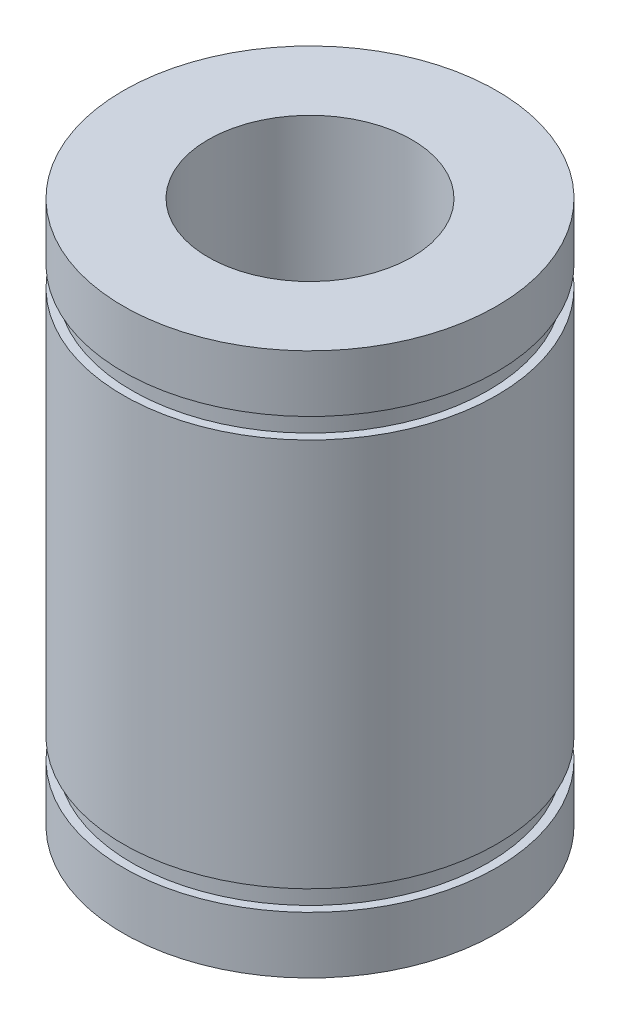
ISO-10303-21;
HEADER;
FILE_DESCRIPTION(('STEP AP214'),'2;1');
FILE_NAME('part.step','',(''),(''),'','','');
FILE_SCHEMA(('AUTOMOTIVE_DESIGN { 1 0 10303 214 1 1 1 1 }'));
ENDSEC;
DATA;
#1=APPLICATION_CONTEXT('core data for automotive mechanical design processes');
#2=APPLICATION_PROTOCOL_DEFINITION('international standard','automotive_design',2000,#1);
#3=PRODUCT_CONTEXT('',#1,'mechanical');
#4=PRODUCT('Part','Part','',(#3));
#5=PRODUCT_RELATED_PRODUCT_CATEGORY('part','',(#4));
#6=PRODUCT_DEFINITION_FORMATION('','',#4);
#7=PRODUCT_DEFINITION_CONTEXT('part definition',#1,'design');
#8=PRODUCT_DEFINITION('design','',#6,#7);
#9=PRODUCT_DEFINITION_SHAPE('','',#8);
#10=(LENGTH_UNIT() NAMED_UNIT(*) SI_UNIT(.MILLI.,.METRE.));
#11=(NAMED_UNIT(*) PLANE_ANGLE_UNIT() SI_UNIT($,.RADIAN.));
#12=(NAMED_UNIT(*) SI_UNIT($,.STERADIAN.) SOLID_ANGLE_UNIT());
#13=UNCERTAINTY_MEASURE_WITH_UNIT(LENGTH_MEASURE(1.E-05),#10,'distance_accuracy_value','');
#14=(GEOMETRIC_REPRESENTATION_CONTEXT(3) GLOBAL_UNCERTAINTY_ASSIGNED_CONTEXT((#13)) GLOBAL_UNIT_ASSIGNED_CONTEXT((#10,
#11,#12)) REPRESENTATION_CONTEXT('',''));
#15=CARTESIAN_POINT('',(0.,0.,0.));
#16=DIRECTION('',(0.,0.,1.));
#17=DIRECTION('',(1.,0.,0.));
#18=AXIS2_PLACEMENT_3D('',#15,#16,#17);
#19=CARTESIAN_POINT('',(11.,-16.4838233890922,0.));
#20=DIRECTION('',(0.,-1.,0.));
#21=DIRECTION('',(1.,0.,0.));
#22=AXIS2_PLACEMENT_3D('',#19,#20,#21);
#23=PLANE('',#22);
#24=CARTESIAN_POINT('',(0.,-16.4838233890923,0.));
#25=DIRECTION('',(0.,-1.,0.));
#26=DIRECTION('',(1.,0.,0.));
#27=AXIS2_PLACEMENT_3D('',#24,#25,#26);
#28=CIRCLE('',#27,10.9999999999999);
#29=CARTESIAN_POINT('',(11.,-16.4838233890922,0.));
#30=VERTEX_POINT('',#29);
#31=EDGE_CURVE('E78',#30,#30,#28,.T.);
#32=ORIENTED_EDGE('',*,*,#31,.T.);
#33=EDGE_LOOP('',(#32));
#34=FACE_BOUND('',#33,.T.);
#35=CARTESIAN_POINT('',(0.,-16.4838233890923,0.));
#36=DIRECTION('',(0.,-1.,0.));
#37=DIRECTION('',(1.,0.,0.));
#38=AXIS2_PLACEMENT_3D('',#35,#36,#37);
#39=CIRCLE('',#38,5.99999999999994);
#40=CARTESIAN_POINT('',(6.,-16.4838233890922,0.));
#41=VERTEX_POINT('',#40);
#42=EDGE_CURVE('E12',#41,#41,#39,.T.);
#43=ORIENTED_EDGE('',*,*,#42,.F.);
#44=EDGE_LOOP('',(#43));
#45=FACE_BOUND('',#44,.T.);
#46=ADVANCED_FACE('F38',(#34,#45),#23,.T.);
#47=CARTESIAN_POINT('',(3.49720252756924E-12,-1000.,0.));
#48=DIRECTION('',(0.,-1.,0.));
#49=DIRECTION('',(1.,0.,0.));
#50=AXIS2_PLACEMENT_3D('',#47,#48,#49);
#51=CYLINDRICAL_SURFACE('',#50,6.);
#52=ORIENTED_EDGE('',*,*,#42,.T.);
#53=EDGE_LOOP('',(#52));
#54=FACE_BOUND('',#53,.T.);
#55=CARTESIAN_POINT('',(0.,15.5161766109078,0.));
#56=DIRECTION('',(0.,-1.,0.));
#57=DIRECTION('',(1.,0.,0.));
#58=AXIS2_PLACEMENT_3D('',#55,#56,#57);
#59=CIRCLE('',#58,6.00000000000006);
#60=CARTESIAN_POINT('',(6.,15.5161766109078,0.));
#61=VERTEX_POINT('',#60);
#62=EDGE_CURVE('E44',#61,#61,#59,.T.);
#63=ORIENTED_EDGE('',*,*,#62,.F.);
#64=EDGE_LOOP('',(#63));
#65=FACE_BOUND('',#64,.T.);
#66=ADVANCED_FACE('F96',(#54,#65),#51,.F.);
#67=CARTESIAN_POINT('',(6.00000000000001,15.5161766109078,0.));
#68=DIRECTION('',(0.,1.,0.));
#69=DIRECTION('',(-1.,0.,0.));
#70=AXIS2_PLACEMENT_3D('',#67,#68,#69);
#71=PLANE('',#70);
#72=ORIENTED_EDGE('',*,*,#62,.T.);
#73=EDGE_LOOP('',(#72));
#74=FACE_BOUND('',#73,.T.);
#75=CARTESIAN_POINT('',(0.,15.5161766109078,0.));
#76=DIRECTION('',(0.,-1.,0.));
#77=DIRECTION('',(1.,0.,0.));
#78=AXIS2_PLACEMENT_3D('',#75,#76,#77);
#79=CIRCLE('',#78,11.0000000000001);
#80=CARTESIAN_POINT('',(11.,15.5161766109078,0.));
#81=VERTEX_POINT('',#80);
#82=EDGE_CURVE('E48',#81,#81,#79,.T.);
#83=ORIENTED_EDGE('',*,*,#82,.F.);
#84=EDGE_LOOP('',(#83));
#85=FACE_BOUND('',#84,.T.);
#86=ADVANCED_FACE('F100',(#74,#85),#71,.T.);
#87=CARTESIAN_POINT('',(3.49720252756924E-12,-1000.,0.));
#88=DIRECTION('',(0.,-1.,0.));
#89=DIRECTION('',(1.,0.,0.));
#90=AXIS2_PLACEMENT_3D('',#87,#88,#89);
#91=CYLINDRICAL_SURFACE('',#90,11.);
#92=ORIENTED_EDGE('',*,*,#82,.T.);
#93=EDGE_LOOP('',(#92));
#94=FACE_BOUND('',#93,.T.);
#95=CARTESIAN_POINT('',(0.,12.1661766109078,0.));
#96=DIRECTION('',(0.,-1.,0.));
#97=DIRECTION('',(1.,0.,0.));
#98=AXIS2_PLACEMENT_3D('',#95,#96,#97);
#99=CIRCLE('',#98,11.);
#100=CARTESIAN_POINT('',(11.,12.1661766109078,0.));
#101=VERTEX_POINT('',#100);
#102=EDGE_CURVE('E52',#101,#101,#99,.T.);
#103=ORIENTED_EDGE('',*,*,#102,.F.);
#104=EDGE_LOOP('',(#103));
#105=FACE_BOUND('',#104,.T.);
#106=ADVANCED_FACE('F104',(#94,#105),#91,.T.);
#107=CARTESIAN_POINT('',(11.,12.1661766109078,0.));
#108=DIRECTION('',(0.,-1.,0.));
#109=DIRECTION('',(1.,0.,0.));
#110=AXIS2_PLACEMENT_3D('',#107,#108,#109);
#111=PLANE('',#110);
#112=ORIENTED_EDGE('',*,*,#102,.T.);
#113=EDGE_LOOP('',(#112));
#114=FACE_BOUND('',#113,.T.);
#115=CARTESIAN_POINT('',(0.,12.1661766109078,0.));
#116=DIRECTION('',(0.,-1.,0.));
#117=DIRECTION('',(1.,0.,0.));
#118=AXIS2_PLACEMENT_3D('',#115,#116,#117);
#119=CIRCLE('',#118,10.5);
#120=CARTESIAN_POINT('',(10.5,12.1661766109078,0.));
#121=VERTEX_POINT('',#120);
#122=EDGE_CURVE('E57',#121,#121,#119,.T.);
#123=ORIENTED_EDGE('',*,*,#122,.F.);
#124=EDGE_LOOP('',(#123));
#125=FACE_BOUND('',#124,.T.);
#126=ADVANCED_FACE('F110',(#114,#125),#111,.T.);
#127=CARTESIAN_POINT('',(3.49720252756924E-12,-1000.,0.));
#128=DIRECTION('',(0.,-1.,0.));
#129=DIRECTION('',(1.,0.,0.));
#130=AXIS2_PLACEMENT_3D('',#127,#128,#129);
#131=CYLINDRICAL_SURFACE('',#130,10.5);
#132=ORIENTED_EDGE('',*,*,#122,.T.);
#133=EDGE_LOOP('',(#132));
#134=FACE_BOUND('',#133,.T.);
#135=CARTESIAN_POINT('',(0.,10.9661766109077,0.));
#136=DIRECTION('',(0.,-1.,0.));
#137=DIRECTION('',(1.,0.,0.));
#138=AXIS2_PLACEMENT_3D('',#135,#136,#137);
#139=CIRCLE('',#138,10.5);
#140=CARTESIAN_POINT('',(10.5,10.9661766109077,0.));
#141=VERTEX_POINT('',#140);
#142=EDGE_CURVE('E60',#141,#141,#139,.T.);
#143=ORIENTED_EDGE('',*,*,#142,.F.);
#144=EDGE_LOOP('',(#143));
#145=FACE_BOUND('',#144,.T.);
#146=ADVANCED_FACE('F114',(#134,#145),#131,.T.);
#147=CARTESIAN_POINT('',(10.5,10.9661766109078,0.));
#148=DIRECTION('',(0.,1.,0.));
#149=DIRECTION('',(-1.,0.,0.));
#150=AXIS2_PLACEMENT_3D('',#147,#148,#149);
#151=PLANE('',#150);
#152=ORIENTED_EDGE('',*,*,#142,.T.);
#153=EDGE_LOOP('',(#152));
#154=FACE_BOUND('',#153,.T.);
#155=CARTESIAN_POINT('',(0.,10.9661766109077,0.));
#156=DIRECTION('',(0.,-1.,0.));
#157=DIRECTION('',(1.,0.,0.));
#158=AXIS2_PLACEMENT_3D('',#155,#156,#157);
#159=CIRCLE('',#158,11.);
#160=CARTESIAN_POINT('',(11.,10.9661766109077,0.));
#161=VERTEX_POINT('',#160);
#162=EDGE_CURVE('E63',#161,#161,#159,.T.);
#163=ORIENTED_EDGE('',*,*,#162,.F.);
#164=EDGE_LOOP('',(#163));
#165=FACE_BOUND('',#164,.T.);
#166=ADVANCED_FACE('F118',(#154,#165),#151,.T.);
#167=CARTESIAN_POINT('',(3.49720252756924E-12,-1000.,0.));
#168=DIRECTION('',(0.,-1.,0.));
#169=DIRECTION('',(1.,0.,0.));
#170=AXIS2_PLACEMENT_3D('',#167,#168,#169);
#171=CYLINDRICAL_SURFACE('',#170,11.);
#172=ORIENTED_EDGE('',*,*,#162,.T.);
#173=EDGE_LOOP('',(#172));
#174=FACE_BOUND('',#173,.T.);
#175=CARTESIAN_POINT('',(0.,-11.9338233890922,0.));
#176=DIRECTION('',(0.,-1.,0.));
#177=DIRECTION('',(1.,0.,0.));
#178=AXIS2_PLACEMENT_3D('',#175,#176,#177);
#179=CIRCLE('',#178,11.);
#180=CARTESIAN_POINT('',(11.,-11.9338233890922,0.));
#181=VERTEX_POINT('',#180);
#182=EDGE_CURVE('E66',#181,#181,#179,.T.);
#183=ORIENTED_EDGE('',*,*,#182,.F.);
#184=EDGE_LOOP('',(#183));
#185=FACE_BOUND('',#184,.T.);
#186=ADVANCED_FACE('F122',(#174,#185),#171,.T.);
#187=CARTESIAN_POINT('',(11.,-11.9338233890922,0.));
#188=DIRECTION('',(0.,-1.,0.));
#189=DIRECTION('',(1.,0.,0.));
#190=AXIS2_PLACEMENT_3D('',#187,#188,#189);
#191=PLANE('',#190);
#192=ORIENTED_EDGE('',*,*,#182,.T.);
#193=EDGE_LOOP('',(#192));
#194=FACE_BOUND('',#193,.T.);
#195=CARTESIAN_POINT('',(0.,-11.9338233890922,0.));
#196=DIRECTION('',(0.,-1.,0.));
#197=DIRECTION('',(1.,0.,0.));
#198=AXIS2_PLACEMENT_3D('',#195,#196,#197);
#199=CIRCLE('',#198,10.5);
#200=CARTESIAN_POINT('',(10.5,-11.9338233890922,0.));
#201=VERTEX_POINT('',#200);
#202=EDGE_CURVE('E69',#201,#201,#199,.T.);
#203=ORIENTED_EDGE('',*,*,#202,.F.);
#204=EDGE_LOOP('',(#203));
#205=FACE_BOUND('',#204,.T.);
#206=ADVANCED_FACE('F126',(#194,#205),#191,.T.);
#207=CARTESIAN_POINT('',(3.49720252756924E-12,-1000.,0.));
#208=DIRECTION('',(0.,-1.,0.));
#209=DIRECTION('',(1.,0.,0.));
#210=AXIS2_PLACEMENT_3D('',#207,#208,#209);
#211=CYLINDRICAL_SURFACE('',#210,10.5);
#212=ORIENTED_EDGE('',*,*,#202,.T.);
#213=EDGE_LOOP('',(#212));
#214=FACE_BOUND('',#213,.T.);
#215=CARTESIAN_POINT('',(0.,-13.1338233890922,0.));
#216=DIRECTION('',(0.,-1.,0.));
#217=DIRECTION('',(1.,0.,0.));
#218=AXIS2_PLACEMENT_3D('',#215,#216,#217);
#219=CIRCLE('',#218,10.5);
#220=CARTESIAN_POINT('',(10.5,-13.1338233890922,0.));
#221=VERTEX_POINT('',#220);
#222=EDGE_CURVE('E72',#221,#221,#219,.T.);
#223=ORIENTED_EDGE('',*,*,#222,.F.);
#224=EDGE_LOOP('',(#223));
#225=FACE_BOUND('',#224,.T.);
#226=ADVANCED_FACE('F92',(#214,#225),#211,.T.);
#227=CARTESIAN_POINT('',(10.5,-13.1338233890922,0.));
#228=DIRECTION('',(0.,1.,0.));
#229=DIRECTION('',(-1.,0.,0.));
#230=AXIS2_PLACEMENT_3D('',#227,#228,#229);
#231=PLANE('',#230);
#232=ORIENTED_EDGE('',*,*,#222,.T.);
#233=EDGE_LOOP('',(#232));
#234=FACE_BOUND('',#233,.T.);
#235=CARTESIAN_POINT('',(0.,-13.1338233890922,0.));
#236=DIRECTION('',(0.,-1.,0.));
#237=DIRECTION('',(1.,0.,0.));
#238=AXIS2_PLACEMENT_3D('',#235,#236,#237);
#239=CIRCLE('',#238,11.);
#240=CARTESIAN_POINT('',(11.,-13.1338233890922,0.));
#241=VERTEX_POINT('',#240);
#242=EDGE_CURVE('E75',#241,#241,#239,.T.);
#243=ORIENTED_EDGE('',*,*,#242,.F.);
#244=EDGE_LOOP('',(#243));
#245=FACE_BOUND('',#244,.T.);
#246=ADVANCED_FACE('F86',(#234,#245),#231,.T.);
#247=CARTESIAN_POINT('',(3.49720252756924E-12,-1000.,0.));
#248=DIRECTION('',(0.,-1.,0.));
#249=DIRECTION('',(1.,0.,0.));
#250=AXIS2_PLACEMENT_3D('',#247,#248,#249);
#251=CYLINDRICAL_SURFACE('',#250,10.9999999999999);
#252=ORIENTED_EDGE('',*,*,#242,.T.);
#253=EDGE_LOOP('',(#252));
#254=FACE_BOUND('',#253,.T.);
#255=ORIENTED_EDGE('',*,*,#31,.F.);
#256=EDGE_LOOP('',(#255));
#257=FACE_BOUND('',#256,.T.);
#258=ADVANCED_FACE('F84',(#254,#257),#251,.T.);
#259=CLOSED_SHELL('',(#46,#66,#86,#106,#126,#146,#166,#186,#206,#226,#246,#258));
#260=MANIFOLD_SOLID_BREP('B2',#259);
#261=ADVANCED_BREP_SHAPE_REPRESENTATION('',(#18,#260),#14);
#262=SHAPE_DEFINITION_REPRESENTATION(#9,#261);
ENDSEC;
END-ISO-10303-21;
